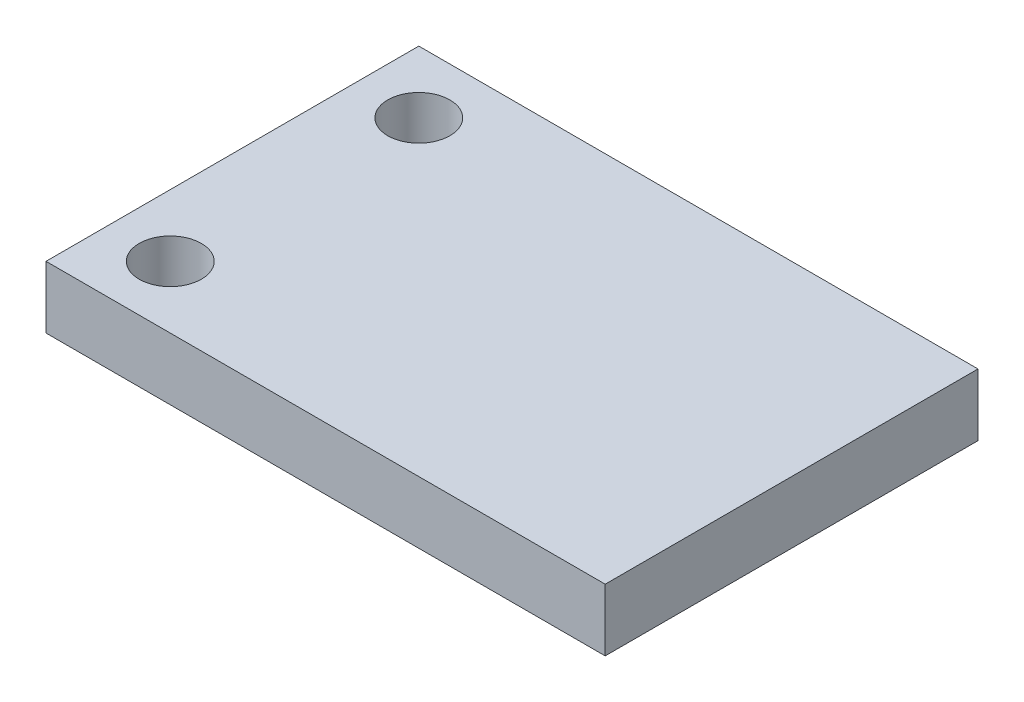
ISO-10303-21;
HEADER;
FILE_DESCRIPTION(('STEP AP214'),'2;1');
FILE_NAME('part.step','',(''),(''),'','','');
FILE_SCHEMA(('AUTOMOTIVE_DESIGN { 1 0 10303 214 1 1 1 1 }'));
ENDSEC;
DATA;
#1=APPLICATION_CONTEXT('core data for automotive mechanical design processes');
#2=APPLICATION_PROTOCOL_DEFINITION('international standard','automotive_design',2000,#1);
#3=PRODUCT_CONTEXT('',#1,'mechanical');
#4=PRODUCT('Part','Part','',(#3));
#5=PRODUCT_RELATED_PRODUCT_CATEGORY('part','',(#4));
#6=PRODUCT_DEFINITION_FORMATION('','',#4);
#7=PRODUCT_DEFINITION_CONTEXT('part definition',#1,'design');
#8=PRODUCT_DEFINITION('design','',#6,#7);
#9=PRODUCT_DEFINITION_SHAPE('','',#8);
#10=(LENGTH_UNIT() NAMED_UNIT(*) SI_UNIT(.MILLI.,.METRE.));
#11=(NAMED_UNIT(*) PLANE_ANGLE_UNIT() SI_UNIT($,.RADIAN.));
#12=(NAMED_UNIT(*) SI_UNIT($,.STERADIAN.) SOLID_ANGLE_UNIT());
#13=UNCERTAINTY_MEASURE_WITH_UNIT(LENGTH_MEASURE(1.E-05),#10,'distance_accuracy_value','');
#14=(GEOMETRIC_REPRESENTATION_CONTEXT(3) GLOBAL_UNCERTAINTY_ASSIGNED_CONTEXT((#13)) GLOBAL_UNIT_ASSIGNED_CONTEXT((#10,
#11,#12)) REPRESENTATION_CONTEXT('',''));
#15=CARTESIAN_POINT('',(0.,0.,0.));
#16=DIRECTION('',(0.,0.,1.));
#17=DIRECTION('',(1.,0.,0.));
#18=AXIS2_PLACEMENT_3D('',#15,#16,#17);
#19=CARTESIAN_POINT('',(0.,10.,0.));
#20=DIRECTION('',(0.,-1.,0.));
#21=DIRECTION('',(0.,0.,-1.));
#22=AXIS2_PLACEMENT_3D('',#19,#20,#21);
#23=PLANE('',#22);
#24=DIRECTION('',(0.,0.,1.));
#25=VECTOR('',#24,1.);
#26=CARTESIAN_POINT('',(0.,10.,0.));
#27=LINE('',#26,#25);
#28=CARTESIAN_POINT('',(0.,10.,-60.));
#29=VERTEX_POINT('',#28);
#30=CARTESIAN_POINT('',(0.,10.,0.));
#31=VERTEX_POINT('',#30);
#32=EDGE_CURVE('E95',#29,#31,#27,.T.);
#33=ORIENTED_EDGE('',*,*,#32,.T.);
#34=DIRECTION('',(1.,0.,0.));
#35=VECTOR('',#34,1.);
#36=CARTESIAN_POINT('',(0.,10.,0.));
#37=LINE('',#36,#35);
#38=CARTESIAN_POINT('',(90.,10.,0.));
#39=VERTEX_POINT('',#38);
#40=EDGE_CURVE('E90',#31,#39,#37,.T.);
#41=ORIENTED_EDGE('',*,*,#40,.T.);
#42=DIRECTION('',(0.,0.,-1.));
#43=VECTOR('',#42,1.);
#44=CARTESIAN_POINT('',(90.,10.,0.));
#45=LINE('',#44,#43);
#46=CARTESIAN_POINT('',(90.,10.,-60.));
#47=VERTEX_POINT('',#46);
#48=EDGE_CURVE('E93',#39,#47,#45,.T.);
#49=ORIENTED_EDGE('',*,*,#48,.T.);
#50=DIRECTION('',(-1.,0.,0.));
#51=VECTOR('',#50,1.);
#52=CARTESIAN_POINT('',(0.,10.,-60.));
#53=LINE('',#52,#51);
#54=EDGE_CURVE('E60',#47,#29,#53,.T.);
#55=ORIENTED_EDGE('',*,*,#54,.T.);
#56=EDGE_LOOP('',(#33,#41,#49,#55));
#57=FACE_BOUND('',#56,.T.);
#58=CARTESIAN_POINT('',(10.,10.,-50.));
#59=DIRECTION('',(0.,1.,0.));
#60=DIRECTION('',(0.,0.,1.));
#61=AXIS2_PLACEMENT_3D('',#58,#59,#60);
#62=CIRCLE('',#61,5.);
#63=CARTESIAN_POINT('',(10.,10.,-45.));
#64=VERTEX_POINT('',#63);
#65=EDGE_CURVE('E115',#64,#64,#62,.T.);
#66=ORIENTED_EDGE('',*,*,#65,.F.);
#67=EDGE_LOOP('',(#66));
#68=FACE_BOUND('',#67,.T.);
#69=CARTESIAN_POINT('',(10.,10.,-9.99999999999999));
#70=DIRECTION('',(0.,1.,0.));
#71=DIRECTION('',(0.,0.,1.));
#72=AXIS2_PLACEMENT_3D('',#69,#70,#71);
#73=CIRCLE('',#72,5.);
#74=CARTESIAN_POINT('',(10.,10.,-5.));
#75=VERTEX_POINT('',#74);
#76=EDGE_CURVE('E137',#75,#75,#73,.T.);
#77=ORIENTED_EDGE('',*,*,#76,.F.);
#78=EDGE_LOOP('',(#77));
#79=FACE_BOUND('',#78,.T.);
#80=ADVANCED_FACE('F42',(#57,#68,#79),#23,.F.);
#81=CARTESIAN_POINT('',(0.,0.,0.));
#82=DIRECTION('',(0.,-1.,0.));
#83=DIRECTION('',(0.,0.,-1.));
#84=AXIS2_PLACEMENT_3D('',#81,#82,#83);
#85=PLANE('',#84);
#86=CARTESIAN_POINT('',(10.,0.,-50.));
#87=DIRECTION('',(0.,1.,0.));
#88=DIRECTION('',(0.,0.,1.));
#89=AXIS2_PLACEMENT_3D('',#86,#87,#88);
#90=CIRCLE('',#89,5.);
#91=CARTESIAN_POINT('',(10.,0.,-45.));
#92=VERTEX_POINT('',#91);
#93=EDGE_CURVE('E133',#92,#92,#90,.T.);
#94=ORIENTED_EDGE('',*,*,#93,.T.);
#95=EDGE_LOOP('',(#94));
#96=FACE_BOUND('',#95,.T.);
#97=DIRECTION('',(0.,0.,1.));
#98=VECTOR('',#97,1.);
#99=CARTESIAN_POINT('',(0.,0.,0.));
#100=LINE('',#99,#98);
#101=CARTESIAN_POINT('',(0.,0.,-60.));
#102=VERTEX_POINT('',#101);
#103=CARTESIAN_POINT('',(0.,0.,0.));
#104=VERTEX_POINT('',#103);
#105=EDGE_CURVE('E111',#102,#104,#100,.T.);
#106=ORIENTED_EDGE('',*,*,#105,.F.);
#107=DIRECTION('',(-1.,0.,0.));
#108=VECTOR('',#107,1.);
#109=CARTESIAN_POINT('',(0.,0.,-60.));
#110=LINE('',#109,#108);
#111=CARTESIAN_POINT('',(90.,0.,-60.));
#112=VERTEX_POINT('',#111);
#113=EDGE_CURVE('E83',#112,#102,#110,.T.);
#114=ORIENTED_EDGE('',*,*,#113,.F.);
#115=DIRECTION('',(0.,0.,-1.));
#116=VECTOR('',#115,1.);
#117=CARTESIAN_POINT('',(90.,0.,0.));
#118=LINE('',#117,#116);
#119=CARTESIAN_POINT('',(90.,0.,0.));
#120=VERTEX_POINT('',#119);
#121=EDGE_CURVE('E77',#120,#112,#118,.T.);
#122=ORIENTED_EDGE('',*,*,#121,.F.);
#123=DIRECTION('',(1.,0.,0.));
#124=VECTOR('',#123,1.);
#125=CARTESIAN_POINT('',(0.,0.,0.));
#126=LINE('',#125,#124);
#127=EDGE_CURVE('E100',#104,#120,#126,.T.);
#128=ORIENTED_EDGE('',*,*,#127,.F.);
#129=EDGE_LOOP('',(#106,#114,#122,#128));
#130=FACE_BOUND('',#129,.T.);
#131=CARTESIAN_POINT('',(10.,0.,-9.99999999999999));
#132=DIRECTION('',(0.,1.,0.));
#133=DIRECTION('',(0.,0.,1.));
#134=AXIS2_PLACEMENT_3D('',#131,#132,#133);
#135=CIRCLE('',#134,5.);
#136=CARTESIAN_POINT('',(10.,0.,-5.));
#137=VERTEX_POINT('',#136);
#138=EDGE_CURVE('E141',#137,#137,#135,.T.);
#139=ORIENTED_EDGE('',*,*,#138,.T.);
#140=EDGE_LOOP('',(#139));
#141=FACE_BOUND('',#140,.T.);
#142=ADVANCED_FACE('F128',(#96,#130,#141),#85,.T.);
#143=CARTESIAN_POINT('',(0.,10.,0.));
#144=DIRECTION('',(1.,0.,0.));
#145=DIRECTION('',(0.,0.,-1.));
#146=AXIS2_PLACEMENT_3D('',#143,#144,#145);
#147=PLANE('',#146);
#148=ORIENTED_EDGE('',*,*,#105,.T.);
#149=DIRECTION('',(0.,-1.,0.));
#150=VECTOR('',#149,1.);
#151=CARTESIAN_POINT('',(0.,10.,0.));
#152=LINE('',#151,#150);
#153=EDGE_CURVE('E11',#31,#104,#152,.T.);
#154=ORIENTED_EDGE('',*,*,#153,.F.);
#155=ORIENTED_EDGE('',*,*,#32,.F.);
#156=DIRECTION('',(0.,-1.,0.));
#157=VECTOR('',#156,1.);
#158=CARTESIAN_POINT('',(0.,10.,-60.));
#159=LINE('',#158,#157);
#160=EDGE_CURVE('E107',#29,#102,#159,.T.);
#161=ORIENTED_EDGE('',*,*,#160,.T.);
#162=EDGE_LOOP('',(#148,#154,#155,#161));
#163=FACE_BOUND('',#162,.T.);
#164=ADVANCED_FACE('F44',(#163),#147,.F.);
#165=CARTESIAN_POINT('',(0.,10.,0.));
#166=DIRECTION('',(0.,0.,-1.));
#167=DIRECTION('',(-1.,0.,0.));
#168=AXIS2_PLACEMENT_3D('',#165,#166,#167);
#169=PLANE('',#168);
#170=ORIENTED_EDGE('',*,*,#127,.T.);
#171=DIRECTION('',(0.,-1.,0.));
#172=VECTOR('',#171,1.);
#173=CARTESIAN_POINT('',(90.,10.,0.));
#174=LINE('',#173,#172);
#175=EDGE_CURVE('E52',#39,#120,#174,.T.);
#176=ORIENTED_EDGE('',*,*,#175,.F.);
#177=ORIENTED_EDGE('',*,*,#40,.F.);
#178=ORIENTED_EDGE('',*,*,#153,.T.);
#179=EDGE_LOOP('',(#170,#176,#177,#178));
#180=FACE_BOUND('',#179,.T.);
#181=ADVANCED_FACE('F99',(#180),#169,.F.);
#182=CARTESIAN_POINT('',(90.,10.,0.));
#183=DIRECTION('',(-1.,0.,0.));
#184=DIRECTION('',(0.,0.,1.));
#185=AXIS2_PLACEMENT_3D('',#182,#183,#184);
#186=PLANE('',#185);
#187=ORIENTED_EDGE('',*,*,#121,.T.);
#188=DIRECTION('',(0.,-1.,0.));
#189=VECTOR('',#188,1.);
#190=CARTESIAN_POINT('',(90.,10.,-60.));
#191=LINE('',#190,#189);
#192=EDGE_CURVE('E102',#47,#112,#191,.T.);
#193=ORIENTED_EDGE('',*,*,#192,.F.);
#194=ORIENTED_EDGE('',*,*,#48,.F.);
#195=ORIENTED_EDGE('',*,*,#175,.T.);
#196=EDGE_LOOP('',(#187,#193,#194,#195));
#197=FACE_BOUND('',#196,.T.);
#198=ADVANCED_FACE('F103',(#197),#186,.F.);
#199=CARTESIAN_POINT('',(0.,10.,-60.));
#200=DIRECTION('',(0.,0.,1.));
#201=DIRECTION('',(1.,0.,0.));
#202=AXIS2_PLACEMENT_3D('',#199,#200,#201);
#203=PLANE('',#202);
#204=ORIENTED_EDGE('',*,*,#113,.T.);
#205=ORIENTED_EDGE('',*,*,#160,.F.);
#206=ORIENTED_EDGE('',*,*,#54,.F.);
#207=ORIENTED_EDGE('',*,*,#192,.T.);
#208=EDGE_LOOP('',(#204,#205,#206,#207));
#209=FACE_BOUND('',#208,.T.);
#210=ADVANCED_FACE('F125',(#209),#203,.F.);
#211=CARTESIAN_POINT('',(10.,10.,-50.));
#212=DIRECTION('',(0.,-1.,0.));
#213=DIRECTION('',(0.,0.,-1.));
#214=AXIS2_PLACEMENT_3D('',#211,#212,#213);
#215=CYLINDRICAL_SURFACE('',#214,5.);
#216=ORIENTED_EDGE('',*,*,#65,.T.);
#217=EDGE_LOOP('',(#216));
#218=FACE_BOUND('',#217,.T.);
#219=ORIENTED_EDGE('',*,*,#93,.F.);
#220=EDGE_LOOP('',(#219));
#221=FACE_BOUND('',#220,.T.);
#222=ADVANCED_FACE('F160',(#218,#221),#215,.F.);
#223=CARTESIAN_POINT('',(10.,10.,-9.99999999999999));
#224=DIRECTION('',(0.,-1.,0.));
#225=DIRECTION('',(0.,0.,-1.));
#226=AXIS2_PLACEMENT_3D('',#223,#224,#225);
#227=CYLINDRICAL_SURFACE('',#226,5.);
#228=ORIENTED_EDGE('',*,*,#76,.T.);
#229=EDGE_LOOP('',(#228));
#230=FACE_BOUND('',#229,.T.);
#231=ORIENTED_EDGE('',*,*,#138,.F.);
#232=EDGE_LOOP('',(#231));
#233=FACE_BOUND('',#232,.T.);
#234=ADVANCED_FACE('F149',(#230,#233),#227,.F.);
#235=CLOSED_SHELL('',(#80,#142,#164,#181,#198,#210,#222,#234));
#236=MANIFOLD_SOLID_BREP('B2',#235);
#237=ADVANCED_BREP_SHAPE_REPRESENTATION('',(#18,#236),#14);
#238=SHAPE_DEFINITION_REPRESENTATION(#9,#237);
ENDSEC;
END-ISO-10303-21;
